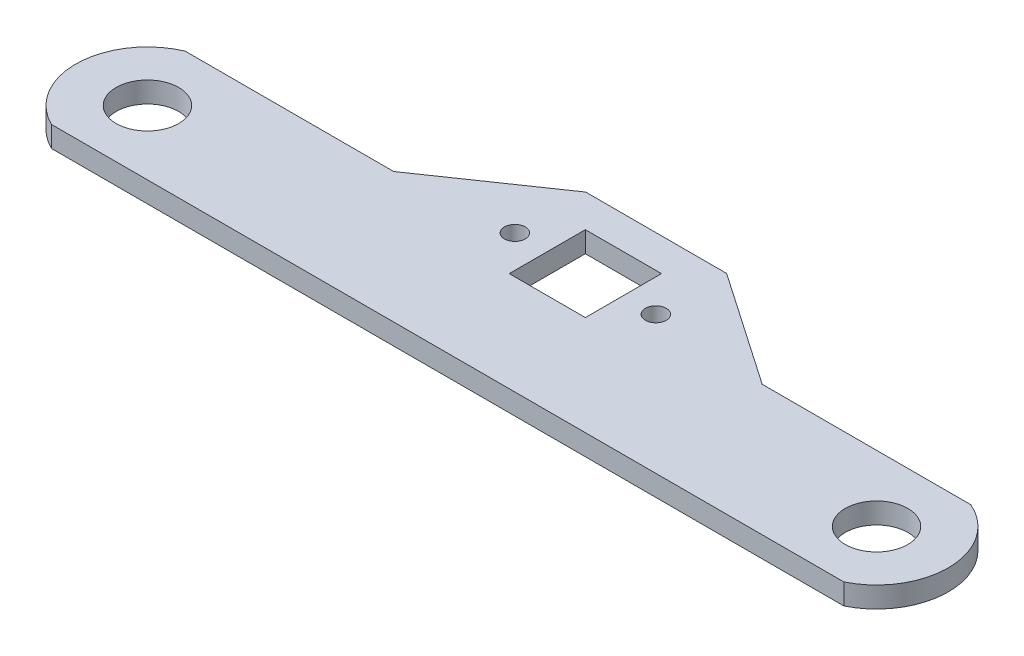
ISO-10303-21;
HEADER;
FILE_DESCRIPTION(('STEP AP214'),'2;1');
FILE_NAME('part.step','',(''),(''),'','','');
FILE_SCHEMA(('AUTOMOTIVE_DESIGN { 1 0 10303 214 1 1 1 1 }'));
ENDSEC;
DATA;
#1=APPLICATION_CONTEXT('core data for automotive mechanical design processes');
#2=APPLICATION_PROTOCOL_DEFINITION('international standard','automotive_design',2000,#1);
#3=PRODUCT_CONTEXT('',#1,'mechanical');
#4=PRODUCT('Part','Part','',(#3));
#5=PRODUCT_RELATED_PRODUCT_CATEGORY('part','',(#4));
#6=PRODUCT_DEFINITION_FORMATION('','',#4);
#7=PRODUCT_DEFINITION_CONTEXT('part definition',#1,'design');
#8=PRODUCT_DEFINITION('design','',#6,#7);
#9=PRODUCT_DEFINITION_SHAPE('','',#8);
#10=(LENGTH_UNIT() NAMED_UNIT(*) SI_UNIT(.MILLI.,.METRE.));
#11=(NAMED_UNIT(*) PLANE_ANGLE_UNIT() SI_UNIT($,.RADIAN.));
#12=(NAMED_UNIT(*) SI_UNIT($,.STERADIAN.) SOLID_ANGLE_UNIT());
#13=UNCERTAINTY_MEASURE_WITH_UNIT(LENGTH_MEASURE(1.E-05),#10,'distance_accuracy_value','');
#14=(GEOMETRIC_REPRESENTATION_CONTEXT(3) GLOBAL_UNCERTAINTY_ASSIGNED_CONTEXT((#13)) GLOBAL_UNIT_ASSIGNED_CONTEXT((#10,
#11,#12)) REPRESENTATION_CONTEXT('',''));
#15=CARTESIAN_POINT('',(0.,0.,0.));
#16=DIRECTION('',(0.,0.,1.));
#17=DIRECTION('',(1.,0.,0.));
#18=AXIS2_PLACEMENT_3D('',#15,#16,#17);
#19=CARTESIAN_POINT('',(-44.40157102088,2.54,-7.84189292934212));
#20=DIRECTION('',(0.,-1.,0.));
#21=DIRECTION('',(0.,0.,-1.));
#22=AXIS2_PLACEMENT_3D('',#19,#20,#21);
#23=PLANE('',#22);
#24=CARTESIAN_POINT('',(-44.40157102088,2.54,-7.84189292934212));
#25=DIRECTION('',(0.,1.,0.));
#26=DIRECTION('',(0.,0.,1.));
#27=AXIS2_PLACEMENT_3D('',#24,#25,#26);
#28=CIRCLE('',#27,3.81);
#29=CARTESIAN_POINT('',(-44.40157102088,2.54,-4.03189292934212));
#30=VERTEX_POINT('',#29);
#31=EDGE_CURVE('E320',#30,#30,#28,.T.);
#32=ORIENTED_EDGE('',*,*,#31,.F.);
#33=EDGE_LOOP('',(#32));
#34=FACE_BOUND('',#33,.T.);
#35=CARTESIAN_POINT('',(-8.5852,2.54,-16.7767));
#36=DIRECTION('',(0.,1.,0.));
#37=DIRECTION('',(0.,0.,1.));
#38=AXIS2_PLACEMENT_3D('',#35,#36,#37);
#39=CIRCLE('',#38,1.27);
#40=CARTESIAN_POINT('',(-8.5852,2.54,-15.5067));
#41=VERTEX_POINT('',#40);
#42=EDGE_CURVE('E151',#41,#41,#39,.T.);
#43=ORIENTED_EDGE('',*,*,#42,.F.);
#44=EDGE_LOOP('',(#43));
#45=FACE_BOUND('',#44,.T.);
#46=CARTESIAN_POINT('',(-44.40157102088,2.54,-7.84189292934212));
#47=DIRECTION('',(0.,1.,0.));
#48=DIRECTION('',(0.,0.,-1.));
#49=AXIS2_PLACEMENT_3D('',#46,#47,#48);
#50=CIRCLE('',#49,8.73972304493564);
#51=CARTESIAN_POINT('',(-47.8442370943651,2.54,-15.875));
#52=VERTEX_POINT('',#51);
#53=CARTESIAN_POINT('',(-48.26,2.54,0.));
#54=VERTEX_POINT('',#53);
#55=EDGE_CURVE('E161',#52,#54,#50,.T.);
#56=ORIENTED_EDGE('',*,*,#55,.T.);
#57=DIRECTION('',(1.,0.,0.));
#58=VECTOR('',#57,1.);
#59=CARTESIAN_POINT('',(48.26,2.54,0.));
#60=LINE('',#59,#58);
#61=CARTESIAN_POINT('',(48.26,2.54,0.));
#62=VERTEX_POINT('',#61);
#63=EDGE_CURVE('E164',#54,#62,#60,.T.);
#64=ORIENTED_EDGE('',*,*,#63,.T.);
#65=CARTESIAN_POINT('',(44.40157102088,2.54,-7.84189292934212));
#66=DIRECTION('',(0.,1.,0.));
#67=DIRECTION('',(0.,0.,1.));
#68=AXIS2_PLACEMENT_3D('',#65,#66,#67);
#69=CIRCLE('',#68,8.73972304493564);
#70=CARTESIAN_POINT('',(47.8442370943651,2.54,-15.875));
#71=VERTEX_POINT('',#70);
#72=EDGE_CURVE('E167',#62,#71,#69,.T.);
#73=ORIENTED_EDGE('',*,*,#72,.T.);
#74=DIRECTION('',(-1.,0.,0.));
#75=VECTOR('',#74,1.);
#76=CARTESIAN_POINT('',(47.8442370943651,2.54,-15.875));
#77=LINE('',#76,#75);
#78=CARTESIAN_POINT('',(22.4442370943651,2.54,-15.875));
#79=VERTEX_POINT('',#78);
#80=EDGE_CURVE('E169',#71,#79,#77,.T.);
#81=ORIENTED_EDGE('',*,*,#80,.T.);
#82=DIRECTION('',(-0.82412764033238,0.,-0.566404124667346));
#83=VECTOR('',#82,1.);
#84=CARTESIAN_POINT('',(22.4442370943651,2.54,-15.875));
#85=LINE('',#84,#83);
#86=CARTESIAN_POINT('',(8.5852,2.54,-25.4000000000003));
#87=VERTEX_POINT('',#86);
#88=EDGE_CURVE('E171',#79,#87,#85,.T.);
#89=ORIENTED_EDGE('',*,*,#88,.T.);
#90=DIRECTION('',(-1.,0.,0.));
#91=VECTOR('',#90,1.);
#92=CARTESIAN_POINT('',(-8.5852,2.54,-25.4000000000003));
#93=LINE('',#92,#91);
#94=CARTESIAN_POINT('',(-8.5852,2.54,-25.4000000000003));
#95=VERTEX_POINT('',#94);
#96=EDGE_CURVE('E173',#87,#95,#93,.T.);
#97=ORIENTED_EDGE('',*,*,#96,.T.);
#98=DIRECTION('',(-0.82412764033238,0.,0.566404124667346));
#99=VECTOR('',#98,1.);
#100=CARTESIAN_POINT('',(-22.4442370943651,2.54,-15.875));
#101=LINE('',#100,#99);
#102=CARTESIAN_POINT('',(-22.4442370943651,2.54,-15.875));
#103=VERTEX_POINT('',#102);
#104=EDGE_CURVE('E175',#95,#103,#101,.T.);
#105=ORIENTED_EDGE('',*,*,#104,.T.);
#106=DIRECTION('',(-1.,0.,0.));
#107=VECTOR('',#106,1.);
#108=CARTESIAN_POINT('',(-47.8442370943651,2.54,-15.875));
#109=LINE('',#108,#107);
#110=EDGE_CURVE('E177',#103,#52,#109,.T.);
#111=ORIENTED_EDGE('',*,*,#110,.T.);
#112=EDGE_LOOP('',(#56,#64,#73,#81,#89,#97,#105,#111));
#113=FACE_BOUND('',#112,.T.);
#114=DIRECTION('',(0.,0.,1.));
#115=VECTOR('',#114,1.);
#116=CARTESIAN_POINT('',(-4.6355,2.54,-21.4122));
#117=LINE('',#116,#115);
#118=CARTESIAN_POINT('',(-4.6355,2.54,-21.4122));
#119=VERTEX_POINT('',#118);
#120=CARTESIAN_POINT('',(-4.6355,2.54,-12.1412));
#121=VERTEX_POINT('',#120);
#122=EDGE_CURVE('E122',#119,#121,#117,.T.);
#123=ORIENTED_EDGE('',*,*,#122,.F.);
#124=DIRECTION('',(-1.,0.,0.));
#125=VECTOR('',#124,1.);
#126=CARTESIAN_POINT('',(-4.6355,2.54,-21.4122));
#127=LINE('',#126,#125);
#128=CARTESIAN_POINT('',(4.6355,2.54,-21.4122));
#129=VERTEX_POINT('',#128);
#130=EDGE_CURVE('E145',#129,#119,#127,.T.);
#131=ORIENTED_EDGE('',*,*,#130,.F.);
#132=DIRECTION('',(0.,0.,-1.));
#133=VECTOR('',#132,1.);
#134=CARTESIAN_POINT('',(4.6355,2.54,-21.4122));
#135=LINE('',#134,#133);
#136=CARTESIAN_POINT('',(4.6355,2.54,-12.1412));
#137=VERTEX_POINT('',#136);
#138=EDGE_CURVE('E143',#137,#129,#135,.T.);
#139=ORIENTED_EDGE('',*,*,#138,.F.);
#140=DIRECTION('',(1.,0.,0.));
#141=VECTOR('',#140,1.);
#142=CARTESIAN_POINT('',(-4.6355,2.54,-12.1412));
#143=LINE('',#142,#141);
#144=EDGE_CURVE('E130',#121,#137,#143,.T.);
#145=ORIENTED_EDGE('',*,*,#144,.F.);
#146=EDGE_LOOP('',(#123,#131,#139,#145));
#147=FACE_BOUND('',#146,.T.);
#148=CARTESIAN_POINT('',(8.5852,2.54,-16.7767));
#149=DIRECTION('',(0.,1.,0.));
#150=DIRECTION('',(0.,0.,-1.));
#151=AXIS2_PLACEMENT_3D('',#148,#149,#150);
#152=CIRCLE('',#151,1.27);
#153=CARTESIAN_POINT('',(8.5852,2.54,-18.0467));
#154=VERTEX_POINT('',#153);
#155=EDGE_CURVE('E326',#154,#154,#152,.T.);
#156=ORIENTED_EDGE('',*,*,#155,.F.);
#157=EDGE_LOOP('',(#156));
#158=FACE_BOUND('',#157,.T.);
#159=CARTESIAN_POINT('',(44.40157102088,2.54,-7.84189292934212));
#160=DIRECTION('',(0.,1.,0.));
#161=DIRECTION('',(0.,0.,-1.));
#162=AXIS2_PLACEMENT_3D('',#159,#160,#161);
#163=CIRCLE('',#162,3.81);
#164=CARTESIAN_POINT('',(44.40157102088,2.54,-11.6518929293421));
#165=VERTEX_POINT('',#164);
#166=EDGE_CURVE('E311',#165,#165,#163,.T.);
#167=ORIENTED_EDGE('',*,*,#166,.F.);
#168=EDGE_LOOP('',(#167));
#169=FACE_BOUND('',#168,.T.);
#170=ADVANCED_FACE('F33',(#34,#45,#113,#147,#158,#169),#23,.F.);
#171=CARTESIAN_POINT('',(-44.40157102088,0.,-7.84189292934212));
#172=DIRECTION('',(0.,-1.,0.));
#173=DIRECTION('',(0.,0.,-1.));
#174=AXIS2_PLACEMENT_3D('',#171,#172,#173);
#175=PLANE('',#174);
#176=CARTESIAN_POINT('',(-44.40157102088,0.,-7.84189292934212));
#177=DIRECTION('',(0.,1.,0.));
#178=DIRECTION('',(0.,0.,1.));
#179=AXIS2_PLACEMENT_3D('',#176,#177,#178);
#180=CIRCLE('',#179,3.81);
#181=CARTESIAN_POINT('',(-44.40157102088,0.,-4.03189292934212));
#182=VERTEX_POINT('',#181);
#183=EDGE_CURVE('E317',#182,#182,#180,.T.);
#184=ORIENTED_EDGE('',*,*,#183,.T.);
#185=EDGE_LOOP('',(#184));
#186=FACE_BOUND('',#185,.T.);
#187=CARTESIAN_POINT('',(-8.5852,0.,-16.7767));
#188=DIRECTION('',(0.,1.,0.));
#189=DIRECTION('',(0.,0.,1.));
#190=AXIS2_PLACEMENT_3D('',#187,#188,#189);
#191=CIRCLE('',#190,1.27);
#192=CARTESIAN_POINT('',(-8.5852,0.,-15.5067));
#193=VERTEX_POINT('',#192);
#194=EDGE_CURVE('E329',#193,#193,#191,.T.);
#195=ORIENTED_EDGE('',*,*,#194,.T.);
#196=EDGE_LOOP('',(#195));
#197=FACE_BOUND('',#196,.T.);
#198=CARTESIAN_POINT('',(-44.40157102088,0.,-7.84189292934212));
#199=DIRECTION('',(0.,1.,0.));
#200=DIRECTION('',(0.,0.,-1.));
#201=AXIS2_PLACEMENT_3D('',#198,#199,#200);
#202=CIRCLE('',#201,8.73972304493564);
#203=CARTESIAN_POINT('',(-47.8442370943651,0.,-15.875));
#204=VERTEX_POINT('',#203);
#205=CARTESIAN_POINT('',(-48.26,0.,0.));
#206=VERTEX_POINT('',#205);
#207=EDGE_CURVE('E138',#204,#206,#202,.T.);
#208=ORIENTED_EDGE('',*,*,#207,.F.);
#209=DIRECTION('',(-1.,0.,0.));
#210=VECTOR('',#209,1.);
#211=CARTESIAN_POINT('',(-47.8442370943651,0.,-15.875));
#212=LINE('',#211,#210);
#213=CARTESIAN_POINT('',(-22.4442370943651,0.,-15.875));
#214=VERTEX_POINT('',#213);
#215=EDGE_CURVE('E165',#214,#204,#212,.T.);
#216=ORIENTED_EDGE('',*,*,#215,.F.);
#217=DIRECTION('',(-0.82412764033238,0.,0.566404124667346));
#218=VECTOR('',#217,1.);
#219=CARTESIAN_POINT('',(-22.4442370943651,0.,-15.875));
#220=LINE('',#219,#218);
#221=CARTESIAN_POINT('',(-8.5852,0.,-25.4000000000003));
#222=VERTEX_POINT('',#221);
#223=EDGE_CURVE('E192',#222,#214,#220,.T.);
#224=ORIENTED_EDGE('',*,*,#223,.F.);
#225=DIRECTION('',(-1.,0.,0.));
#226=VECTOR('',#225,1.);
#227=CARTESIAN_POINT('',(-8.5852,0.,-25.4000000000003));
#228=LINE('',#227,#226);
#229=CARTESIAN_POINT('',(8.5852,0.,-25.4000000000003));
#230=VERTEX_POINT('',#229);
#231=EDGE_CURVE('E190',#230,#222,#228,.T.);
#232=ORIENTED_EDGE('',*,*,#231,.F.);
#233=DIRECTION('',(-0.82412764033238,0.,-0.566404124667346));
#234=VECTOR('',#233,1.);
#235=CARTESIAN_POINT('',(22.4442370943651,0.,-15.875));
#236=LINE('',#235,#234);
#237=CARTESIAN_POINT('',(22.4442370943651,0.,-15.875));
#238=VERTEX_POINT('',#237);
#239=EDGE_CURVE('E188',#238,#230,#236,.T.);
#240=ORIENTED_EDGE('',*,*,#239,.F.);
#241=DIRECTION('',(-1.,0.,0.));
#242=VECTOR('',#241,1.);
#243=CARTESIAN_POINT('',(47.8442370943651,0.,-15.875));
#244=LINE('',#243,#242);
#245=CARTESIAN_POINT('',(47.8442370943651,0.,-15.875));
#246=VERTEX_POINT('',#245);
#247=EDGE_CURVE('E186',#246,#238,#244,.T.);
#248=ORIENTED_EDGE('',*,*,#247,.F.);
#249=CARTESIAN_POINT('',(44.40157102088,0.,-7.84189292934212));
#250=DIRECTION('',(0.,1.,0.));
#251=DIRECTION('',(0.,0.,1.));
#252=AXIS2_PLACEMENT_3D('',#249,#250,#251);
#253=CIRCLE('',#252,8.73972304493564);
#254=CARTESIAN_POINT('',(48.26,0.,0.));
#255=VERTEX_POINT('',#254);
#256=EDGE_CURVE('E184',#255,#246,#253,.T.);
#257=ORIENTED_EDGE('',*,*,#256,.F.);
#258=DIRECTION('',(1.,0.,0.));
#259=VECTOR('',#258,1.);
#260=CARTESIAN_POINT('',(48.26,0.,0.));
#261=LINE('',#260,#259);
#262=EDGE_CURVE('E182',#206,#255,#261,.T.);
#263=ORIENTED_EDGE('',*,*,#262,.F.);
#264=EDGE_LOOP('',(#208,#216,#224,#232,#240,#248,#257,#263));
#265=FACE_BOUND('',#264,.T.);
#266=DIRECTION('',(-1.,0.,0.));
#267=VECTOR('',#266,1.);
#268=CARTESIAN_POINT('',(-4.6355,0.,-21.4122));
#269=LINE('',#268,#267);
#270=CARTESIAN_POINT('',(4.6355,0.,-21.4122));
#271=VERTEX_POINT('',#270);
#272=CARTESIAN_POINT('',(-4.6355,0.,-21.4122));
#273=VERTEX_POINT('',#272);
#274=EDGE_CURVE('E131',#271,#273,#269,.T.);
#275=ORIENTED_EDGE('',*,*,#274,.T.);
#276=DIRECTION('',(0.,0.,1.));
#277=VECTOR('',#276,1.);
#278=CARTESIAN_POINT('',(-4.6355,0.,-21.4122));
#279=LINE('',#278,#277);
#280=CARTESIAN_POINT('',(-4.6355,0.,-12.1412));
#281=VERTEX_POINT('',#280);
#282=EDGE_CURVE('E56',#273,#281,#279,.T.);
#283=ORIENTED_EDGE('',*,*,#282,.T.);
#284=DIRECTION('',(1.,0.,0.));
#285=VECTOR('',#284,1.);
#286=CARTESIAN_POINT('',(-4.6355,0.,-12.1412));
#287=LINE('',#286,#285);
#288=CARTESIAN_POINT('',(4.6355,0.,-12.1412));
#289=VERTEX_POINT('',#288);
#290=EDGE_CURVE('E137',#281,#289,#287,.T.);
#291=ORIENTED_EDGE('',*,*,#290,.T.);
#292=DIRECTION('',(0.,0.,-1.));
#293=VECTOR('',#292,1.);
#294=CARTESIAN_POINT('',(4.6355,0.,-21.4122));
#295=LINE('',#294,#293);
#296=EDGE_CURVE('E153',#289,#271,#295,.T.);
#297=ORIENTED_EDGE('',*,*,#296,.T.);
#298=EDGE_LOOP('',(#275,#283,#291,#297));
#299=FACE_BOUND('',#298,.T.);
#300=CARTESIAN_POINT('',(8.5852,0.,-16.7767));
#301=DIRECTION('',(0.,1.,0.));
#302=DIRECTION('',(0.,0.,-1.));
#303=AXIS2_PLACEMENT_3D('',#300,#301,#302);
#304=CIRCLE('',#303,1.27);
#305=CARTESIAN_POINT('',(8.5852,0.,-18.0467));
#306=VERTEX_POINT('',#305);
#307=EDGE_CURVE('E323',#306,#306,#304,.T.);
#308=ORIENTED_EDGE('',*,*,#307,.T.);
#309=EDGE_LOOP('',(#308));
#310=FACE_BOUND('',#309,.T.);
#311=CARTESIAN_POINT('',(44.40157102088,0.,-7.84189292934212));
#312=DIRECTION('',(0.,1.,0.));
#313=DIRECTION('',(0.,0.,-1.));
#314=AXIS2_PLACEMENT_3D('',#311,#312,#313);
#315=CIRCLE('',#314,3.81);
#316=CARTESIAN_POINT('',(44.40157102088,0.,-11.6518929293421));
#317=VERTEX_POINT('',#316);
#318=EDGE_CURVE('E314',#317,#317,#315,.T.);
#319=ORIENTED_EDGE('',*,*,#318,.T.);
#320=EDGE_LOOP('',(#319));
#321=FACE_BOUND('',#320,.T.);
#322=ADVANCED_FACE('F222',(#186,#197,#265,#299,#310,#321),#175,.T.);
#323=CARTESIAN_POINT('',(-44.40157102088,2.54,-7.84189292934212));
#324=DIRECTION('',(0.,-1.,0.));
#325=DIRECTION('',(0.,0.,-1.));
#326=AXIS2_PLACEMENT_3D('',#323,#324,#325);
#327=CYLINDRICAL_SURFACE('',#326,8.73972304493564);
#328=ORIENTED_EDGE('',*,*,#207,.T.);
#329=DIRECTION('',(0.,-1.,0.));
#330=VECTOR('',#329,1.);
#331=CARTESIAN_POINT('',(-48.26,2.54,0.));
#332=LINE('',#331,#330);
#333=EDGE_CURVE('E11',#54,#206,#332,.T.);
#334=ORIENTED_EDGE('',*,*,#333,.F.);
#335=ORIENTED_EDGE('',*,*,#55,.F.);
#336=DIRECTION('',(0.,-1.,0.));
#337=VECTOR('',#336,1.);
#338=CARTESIAN_POINT('',(-47.8442370943651,2.54,-15.875));
#339=LINE('',#338,#337);
#340=EDGE_CURVE('E179',#52,#204,#339,.T.);
#341=ORIENTED_EDGE('',*,*,#340,.T.);
#342=EDGE_LOOP('',(#328,#334,#335,#341));
#343=FACE_BOUND('',#342,.T.);
#344=ADVANCED_FACE('F35',(#343),#327,.T.);
#345=CARTESIAN_POINT('',(48.26,2.54,0.));
#346=DIRECTION('',(0.,0.,-1.));
#347=DIRECTION('',(-1.,0.,0.));
#348=AXIS2_PLACEMENT_3D('',#345,#346,#347);
#349=PLANE('',#348);
#350=ORIENTED_EDGE('',*,*,#262,.T.);
#351=DIRECTION('',(0.,-1.,0.));
#352=VECTOR('',#351,1.);
#353=CARTESIAN_POINT('',(48.26,2.54,0.));
#354=LINE('',#353,#352);
#355=EDGE_CURVE('E41',#62,#255,#354,.T.);
#356=ORIENTED_EDGE('',*,*,#355,.F.);
#357=ORIENTED_EDGE('',*,*,#63,.F.);
#358=ORIENTED_EDGE('',*,*,#333,.T.);
#359=EDGE_LOOP('',(#350,#356,#357,#358));
#360=FACE_BOUND('',#359,.T.);
#361=ADVANCED_FACE('F239',(#360),#349,.F.);
#362=CARTESIAN_POINT('',(44.40157102088,2.54,-7.84189292934212));
#363=DIRECTION('',(0.,-1.,0.));
#364=DIRECTION('',(0.,0.,-1.));
#365=AXIS2_PLACEMENT_3D('',#362,#363,#364);
#366=CYLINDRICAL_SURFACE('',#365,8.73972304493564);
#367=ORIENTED_EDGE('',*,*,#256,.T.);
#368=DIRECTION('',(0.,-1.,0.));
#369=VECTOR('',#368,1.);
#370=CARTESIAN_POINT('',(47.8442370943651,2.54,-15.875));
#371=LINE('',#370,#369);
#372=EDGE_CURVE('E209',#71,#246,#371,.T.);
#373=ORIENTED_EDGE('',*,*,#372,.F.);
#374=ORIENTED_EDGE('',*,*,#72,.F.);
#375=ORIENTED_EDGE('',*,*,#355,.T.);
#376=EDGE_LOOP('',(#367,#373,#374,#375));
#377=FACE_BOUND('',#376,.T.);
#378=ADVANCED_FACE('F216',(#377),#366,.T.);
#379=CARTESIAN_POINT('',(47.8442370943651,2.54,-15.875));
#380=DIRECTION('',(0.,0.,1.));
#381=DIRECTION('',(1.,0.,0.));
#382=AXIS2_PLACEMENT_3D('',#379,#380,#381);
#383=PLANE('',#382);
#384=ORIENTED_EDGE('',*,*,#247,.T.);
#385=DIRECTION('',(0.,-1.,0.));
#386=VECTOR('',#385,1.);
#387=CARTESIAN_POINT('',(22.4442370943651,2.54,-15.875));
#388=LINE('',#387,#386);
#389=EDGE_CURVE('E206',#79,#238,#388,.T.);
#390=ORIENTED_EDGE('',*,*,#389,.F.);
#391=ORIENTED_EDGE('',*,*,#80,.F.);
#392=ORIENTED_EDGE('',*,*,#372,.T.);
#393=EDGE_LOOP('',(#384,#390,#391,#392));
#394=FACE_BOUND('',#393,.T.);
#395=ADVANCED_FACE('F228',(#394),#383,.F.);
#396=CARTESIAN_POINT('',(22.4442370943651,2.54,-15.875));
#397=DIRECTION('',(-0.566404124667346,0.,0.82412764033238));
#398=DIRECTION('',(0.824127640332381,0.,0.566404124667346));
#399=AXIS2_PLACEMENT_3D('',#396,#397,#398);
#400=PLANE('',#399);
#401=ORIENTED_EDGE('',*,*,#239,.T.);
#402=DIRECTION('',(0.,-1.,0.));
#403=VECTOR('',#402,1.);
#404=CARTESIAN_POINT('',(8.5852,2.54,-25.4000000000003));
#405=LINE('',#404,#403);
#406=EDGE_CURVE('E203',#87,#230,#405,.T.);
#407=ORIENTED_EDGE('',*,*,#406,.F.);
#408=ORIENTED_EDGE('',*,*,#88,.F.);
#409=ORIENTED_EDGE('',*,*,#389,.T.);
#410=EDGE_LOOP('',(#401,#407,#408,#409));
#411=FACE_BOUND('',#410,.T.);
#412=ADVANCED_FACE('F232',(#411),#400,.F.);
#413=CARTESIAN_POINT('',(-8.5852,2.54,-25.4000000000003));
#414=DIRECTION('',(0.,0.,1.));
#415=DIRECTION('',(1.,0.,0.));
#416=AXIS2_PLACEMENT_3D('',#413,#414,#415);
#417=PLANE('',#416);
#418=ORIENTED_EDGE('',*,*,#231,.T.);
#419=DIRECTION('',(0.,-1.,0.));
#420=VECTOR('',#419,1.);
#421=CARTESIAN_POINT('',(-8.5852,2.54,-25.4000000000003));
#422=LINE('',#421,#420);
#423=EDGE_CURVE('E200',#95,#222,#422,.T.);
#424=ORIENTED_EDGE('',*,*,#423,.F.);
#425=ORIENTED_EDGE('',*,*,#96,.F.);
#426=ORIENTED_EDGE('',*,*,#406,.T.);
#427=EDGE_LOOP('',(#418,#424,#425,#426));
#428=FACE_BOUND('',#427,.T.);
#429=ADVANCED_FACE('F252',(#428),#417,.F.);
#430=CARTESIAN_POINT('',(-22.4442370943651,2.54,-15.875));
#431=DIRECTION('',(0.566404124667346,0.,0.82412764033238));
#432=DIRECTION('',(0.82412764033238,0.,-0.566404124667346));
#433=AXIS2_PLACEMENT_3D('',#430,#431,#432);
#434=PLANE('',#433);
#435=ORIENTED_EDGE('',*,*,#223,.T.);
#436=DIRECTION('',(0.,-1.,0.));
#437=VECTOR('',#436,1.);
#438=CARTESIAN_POINT('',(-22.4442370943651,2.54,-15.875));
#439=LINE('',#438,#437);
#440=EDGE_CURVE('E197',#103,#214,#439,.T.);
#441=ORIENTED_EDGE('',*,*,#440,.F.);
#442=ORIENTED_EDGE('',*,*,#104,.F.);
#443=ORIENTED_EDGE('',*,*,#423,.T.);
#444=EDGE_LOOP('',(#435,#441,#442,#443));
#445=FACE_BOUND('',#444,.T.);
#446=ADVANCED_FACE('F250',(#445),#434,.F.);
#447=CARTESIAN_POINT('',(-47.8442370943651,2.54,-15.875));
#448=DIRECTION('',(0.,0.,1.));
#449=DIRECTION('',(1.,0.,0.));
#450=AXIS2_PLACEMENT_3D('',#447,#448,#449);
#451=PLANE('',#450);
#452=ORIENTED_EDGE('',*,*,#215,.T.);
#453=ORIENTED_EDGE('',*,*,#340,.F.);
#454=ORIENTED_EDGE('',*,*,#110,.F.);
#455=ORIENTED_EDGE('',*,*,#440,.T.);
#456=EDGE_LOOP('',(#452,#453,#454,#455));
#457=FACE_BOUND('',#456,.T.);
#458=ADVANCED_FACE('F245',(#457),#451,.F.);
#459=CARTESIAN_POINT('',(-4.6355,2.54,-21.4122));
#460=DIRECTION('',(1.,0.,0.));
#461=DIRECTION('',(0.,0.,-1.));
#462=AXIS2_PLACEMENT_3D('',#459,#460,#461);
#463=PLANE('',#462);
#464=ORIENTED_EDGE('',*,*,#282,.F.);
#465=DIRECTION('',(0.,-1.,0.));
#466=VECTOR('',#465,1.);
#467=CARTESIAN_POINT('',(-4.6355,2.54,-21.4122));
#468=LINE('',#467,#466);
#469=EDGE_CURVE('E126',#119,#273,#468,.T.);
#470=ORIENTED_EDGE('',*,*,#469,.F.);
#471=ORIENTED_EDGE('',*,*,#122,.T.);
#472=DIRECTION('',(0.,-1.,0.));
#473=VECTOR('',#472,1.);
#474=CARTESIAN_POINT('',(-4.6355,2.54,-12.1412));
#475=LINE('',#474,#473);
#476=EDGE_CURVE('E125',#121,#281,#475,.T.);
#477=ORIENTED_EDGE('',*,*,#476,.T.);
#478=EDGE_LOOP('',(#464,#470,#471,#477));
#479=FACE_BOUND('',#478,.T.);
#480=ADVANCED_FACE('F124',(#479),#463,.T.);
#481=CARTESIAN_POINT('',(-4.6355,2.54,-12.1412));
#482=DIRECTION('',(0.,0.,-1.));
#483=DIRECTION('',(-1.,0.,0.));
#484=AXIS2_PLACEMENT_3D('',#481,#482,#483);
#485=PLANE('',#484);
#486=ORIENTED_EDGE('',*,*,#290,.F.);
#487=ORIENTED_EDGE('',*,*,#476,.F.);
#488=ORIENTED_EDGE('',*,*,#144,.T.);
#489=DIRECTION('',(0.,-1.,0.));
#490=VECTOR('',#489,1.);
#491=CARTESIAN_POINT('',(4.6355,2.54,-12.1412));
#492=LINE('',#491,#490);
#493=EDGE_CURVE('E139',#137,#289,#492,.T.);
#494=ORIENTED_EDGE('',*,*,#493,.T.);
#495=EDGE_LOOP('',(#486,#487,#488,#494));
#496=FACE_BOUND('',#495,.T.);
#497=ADVANCED_FACE('F134',(#496),#485,.T.);
#498=CARTESIAN_POINT('',(4.6355,2.54,-21.4122));
#499=DIRECTION('',(-1.,0.,0.));
#500=DIRECTION('',(0.,0.,1.));
#501=AXIS2_PLACEMENT_3D('',#498,#499,#500);
#502=PLANE('',#501);
#503=ORIENTED_EDGE('',*,*,#296,.F.);
#504=ORIENTED_EDGE('',*,*,#493,.F.);
#505=ORIENTED_EDGE('',*,*,#138,.T.);
#506=DIRECTION('',(0.,-1.,0.));
#507=VECTOR('',#506,1.);
#508=CARTESIAN_POINT('',(4.6355,2.54,-21.4122));
#509=LINE('',#508,#507);
#510=EDGE_CURVE('E48',#129,#271,#509,.T.);
#511=ORIENTED_EDGE('',*,*,#510,.T.);
#512=EDGE_LOOP('',(#503,#504,#505,#511));
#513=FACE_BOUND('',#512,.T.);
#514=ADVANCED_FACE('F281',(#513),#502,.T.);
#515=CARTESIAN_POINT('',(-4.6355,2.54,-21.4122));
#516=DIRECTION('',(0.,0.,1.));
#517=DIRECTION('',(1.,0.,0.));
#518=AXIS2_PLACEMENT_3D('',#515,#516,#517);
#519=PLANE('',#518);
#520=ORIENTED_EDGE('',*,*,#274,.F.);
#521=ORIENTED_EDGE('',*,*,#510,.F.);
#522=ORIENTED_EDGE('',*,*,#130,.T.);
#523=ORIENTED_EDGE('',*,*,#469,.T.);
#524=EDGE_LOOP('',(#520,#521,#522,#523));
#525=FACE_BOUND('',#524,.T.);
#526=ADVANCED_FACE('F285',(#525),#519,.T.);
#527=CARTESIAN_POINT('',(-8.5852,2.54,-16.7767));
#528=DIRECTION('',(0.,-1.,0.));
#529=DIRECTION('',(0.,0.,-1.));
#530=AXIS2_PLACEMENT_3D('',#527,#528,#529);
#531=CYLINDRICAL_SURFACE('',#530,1.27);
#532=ORIENTED_EDGE('',*,*,#42,.T.);
#533=EDGE_LOOP('',(#532));
#534=FACE_BOUND('',#533,.T.);
#535=ORIENTED_EDGE('',*,*,#194,.F.);
#536=EDGE_LOOP('',(#535));
#537=FACE_BOUND('',#536,.T.);
#538=ADVANCED_FACE('F291',(#534,#537),#531,.F.);
#539=CARTESIAN_POINT('',(8.5852,2.54,-16.7767));
#540=DIRECTION('',(0.,-1.,0.));
#541=DIRECTION('',(0.,0.,-1.));
#542=AXIS2_PLACEMENT_3D('',#539,#540,#541);
#543=CYLINDRICAL_SURFACE('',#542,1.27);
#544=ORIENTED_EDGE('',*,*,#155,.T.);
#545=EDGE_LOOP('',(#544));
#546=FACE_BOUND('',#545,.T.);
#547=ORIENTED_EDGE('',*,*,#307,.F.);
#548=EDGE_LOOP('',(#547));
#549=FACE_BOUND('',#548,.T.);
#550=ADVANCED_FACE('F294',(#546,#549),#543,.F.);
#551=CARTESIAN_POINT('',(-44.40157102088,2.54,-7.84189292934212));
#552=DIRECTION('',(0.,-1.,0.));
#553=DIRECTION('',(0.,0.,-1.));
#554=AXIS2_PLACEMENT_3D('',#551,#552,#553);
#555=CYLINDRICAL_SURFACE('',#554,3.81);
#556=ORIENTED_EDGE('',*,*,#31,.T.);
#557=EDGE_LOOP('',(#556));
#558=FACE_BOUND('',#557,.T.);
#559=ORIENTED_EDGE('',*,*,#183,.F.);
#560=EDGE_LOOP('',(#559));
#561=FACE_BOUND('',#560,.T.);
#562=ADVANCED_FACE('F298',(#558,#561),#555,.F.);
#563=CARTESIAN_POINT('',(44.40157102088,2.54,-7.84189292934212));
#564=DIRECTION('',(0.,-1.,0.));
#565=DIRECTION('',(0.,0.,-1.));
#566=AXIS2_PLACEMENT_3D('',#563,#564,#565);
#567=CYLINDRICAL_SURFACE('',#566,3.81);
#568=ORIENTED_EDGE('',*,*,#166,.T.);
#569=EDGE_LOOP('',(#568));
#570=FACE_BOUND('',#569,.T.);
#571=ORIENTED_EDGE('',*,*,#318,.F.);
#572=EDGE_LOOP('',(#571));
#573=FACE_BOUND('',#572,.T.);
#574=ADVANCED_FACE('F302',(#570,#573),#567,.F.);
#575=CLOSED_SHELL('',(#170,#322,#344,#361,#378,#395,#412,#429,#446,#458,#480,#497,#514,#526,
#538,#550,#562,#574));
#576=MANIFOLD_SOLID_BREP('B2',#575);
#577=ADVANCED_BREP_SHAPE_REPRESENTATION('',(#18,#576),#14);
#578=SHAPE_DEFINITION_REPRESENTATION(#9,#577);
ENDSEC;
END-ISO-10303-21;
